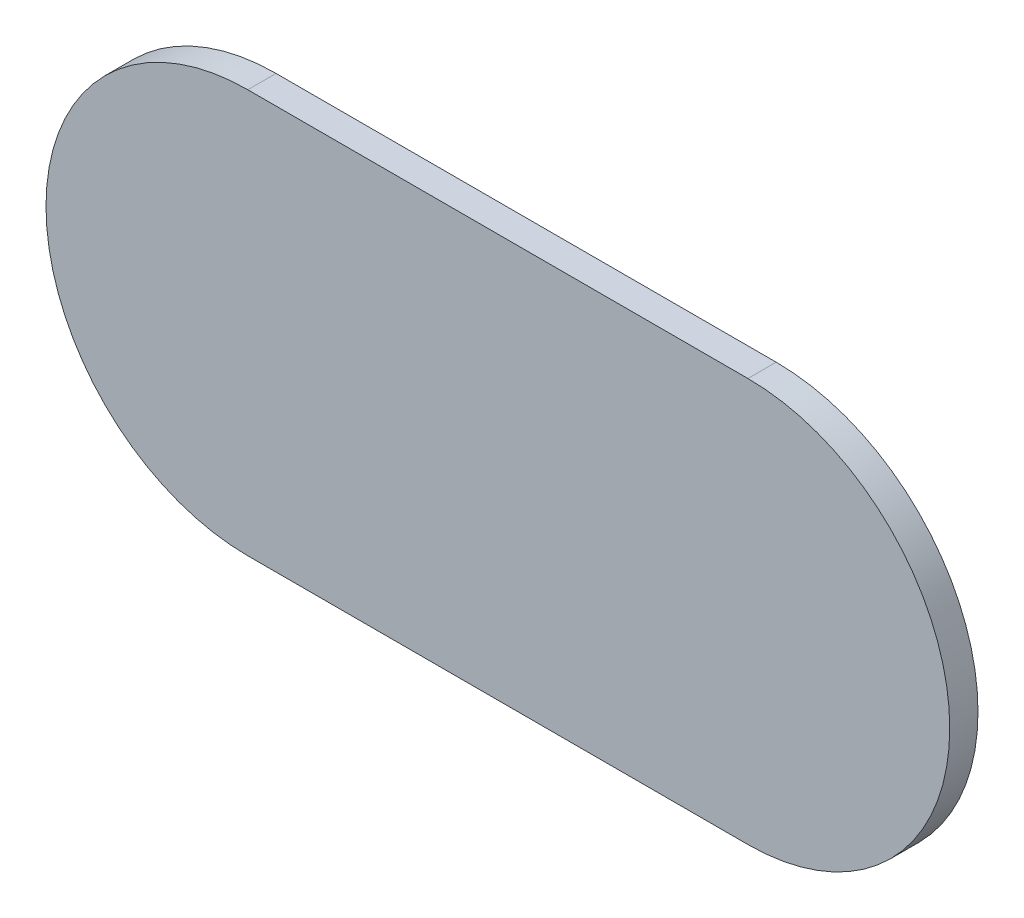
ISO-10303-21;
HEADER;
FILE_DESCRIPTION(('STEP AP214'),'2;1');
FILE_NAME('part.step','',(''),(''),'','','');
FILE_SCHEMA(('AUTOMOTIVE_DESIGN { 1 0 10303 214 1 1 1 1 }'));
ENDSEC;
DATA;
#1=APPLICATION_CONTEXT('core data for automotive mechanical design processes');
#2=APPLICATION_PROTOCOL_DEFINITION('international standard','automotive_design',2000,#1);
#3=PRODUCT_CONTEXT('',#1,'mechanical');
#4=PRODUCT('Part','Part','',(#3));
#5=PRODUCT_RELATED_PRODUCT_CATEGORY('part','',(#4));
#6=PRODUCT_DEFINITION_FORMATION('','',#4);
#7=PRODUCT_DEFINITION_CONTEXT('part definition',#1,'design');
#8=PRODUCT_DEFINITION('design','',#6,#7);
#9=PRODUCT_DEFINITION_SHAPE('','',#8);
#10=(LENGTH_UNIT() NAMED_UNIT(*) SI_UNIT(.MILLI.,.METRE.));
#11=(NAMED_UNIT(*) PLANE_ANGLE_UNIT() SI_UNIT($,.RADIAN.));
#12=(NAMED_UNIT(*) SI_UNIT($,.STERADIAN.) SOLID_ANGLE_UNIT());
#13=UNCERTAINTY_MEASURE_WITH_UNIT(LENGTH_MEASURE(1.E-05),#10,'distance_accuracy_value','');
#14=(GEOMETRIC_REPRESENTATION_CONTEXT(3) GLOBAL_UNCERTAINTY_ASSIGNED_CONTEXT((#13)) GLOBAL_UNIT_ASSIGNED_CONTEXT((#10,
#11,#12)) REPRESENTATION_CONTEXT('',''));
#15=CARTESIAN_POINT('',(0.,0.,0.));
#16=DIRECTION('',(0.,0.,1.));
#17=DIRECTION('',(1.,0.,0.));
#18=AXIS2_PLACEMENT_3D('',#15,#16,#17);
#19=CARTESIAN_POINT('',(135.99,-114.67,1.635));
#20=DIRECTION('',(0.,0.,1.));
#21=DIRECTION('',(1.,0.,0.));
#22=AXIS2_PLACEMENT_3D('',#19,#20,#21);
#23=PLANE('',#22);
#24=DIRECTION('',(1.,0.,0.));
#25=VECTOR('',#24,1.);
#26=CARTESIAN_POINT('',(135.99,-114.67,1.635));
#27=LINE('',#26,#25);
#28=CARTESIAN_POINT('',(135.99,-114.67,1.635));
#29=VERTEX_POINT('',#28);
#30=CARTESIAN_POINT('',(136.609534,-114.67,1.635));
#31=VERTEX_POINT('',#30);
#32=EDGE_CURVE('E91',#29,#31,#27,.T.);
#33=ORIENTED_EDGE('',*,*,#32,.T.);
#34=CARTESIAN_POINT('',(136.609534,-114.42,1.635));
#35=DIRECTION('',(0.,0.,1.));
#36=DIRECTION('',(0.,-1.,0.));
#37=AXIS2_PLACEMENT_3D('',#34,#35,#36);
#38=CIRCLE('',#37,0.25);
#39=CARTESIAN_POINT('',(136.609534,-114.17,1.635));
#40=VERTEX_POINT('',#39);
#41=EDGE_CURVE('E72',#31,#40,#38,.T.);
#42=ORIENTED_EDGE('',*,*,#41,.T.);
#43=DIRECTION('',(-1.,0.,0.));
#44=VECTOR('',#43,1.);
#45=CARTESIAN_POINT('',(136.609534,-114.17,1.635));
#46=LINE('',#45,#44);
#47=CARTESIAN_POINT('',(135.99,-114.17,1.635));
#48=VERTEX_POINT('',#47);
#49=EDGE_CURVE('E84',#40,#48,#46,.T.);
#50=ORIENTED_EDGE('',*,*,#49,.T.);
#51=CARTESIAN_POINT('',(135.99,-114.42,1.635));
#52=DIRECTION('',(0.,0.,1.));
#53=DIRECTION('',(0.,1.,0.));
#54=AXIS2_PLACEMENT_3D('',#51,#52,#53);
#55=CIRCLE('',#54,0.25);
#56=EDGE_CURVE('E11',#48,#29,#55,.T.);
#57=ORIENTED_EDGE('',*,*,#56,.T.);
#58=EDGE_LOOP('',(#33,#42,#50,#57));
#59=FACE_BOUND('',#58,.T.);
#60=ADVANCED_FACE('F17',(#59),#23,.T.);
#61=CARTESIAN_POINT('',(135.99,-114.67,1.6));
#62=DIRECTION('',(0.,0.,1.));
#63=DIRECTION('',(1.,0.,0.));
#64=AXIS2_PLACEMENT_3D('',#61,#62,#63);
#65=PLANE('',#64);
#66=CARTESIAN_POINT('',(135.99,-114.42,1.6));
#67=DIRECTION('',(0.,0.,1.));
#68=DIRECTION('',(0.,1.,0.));
#69=AXIS2_PLACEMENT_3D('',#66,#67,#68);
#70=CIRCLE('',#69,0.25);
#71=CARTESIAN_POINT('',(135.99,-114.17,1.6));
#72=VERTEX_POINT('',#71);
#73=CARTESIAN_POINT('',(135.99,-114.67,1.6));
#74=VERTEX_POINT('',#73);
#75=EDGE_CURVE('E27',#72,#74,#70,.T.);
#76=ORIENTED_EDGE('',*,*,#75,.F.);
#77=DIRECTION('',(-1.,0.,0.));
#78=VECTOR('',#77,1.);
#79=CARTESIAN_POINT('',(136.609534,-114.17,1.6));
#80=LINE('',#79,#78);
#81=CARTESIAN_POINT('',(136.609534,-114.17,1.6));
#82=VERTEX_POINT('',#81);
#83=EDGE_CURVE('E53',#82,#72,#80,.T.);
#84=ORIENTED_EDGE('',*,*,#83,.F.);
#85=CARTESIAN_POINT('',(136.609534,-114.42,1.6));
#86=DIRECTION('',(0.,0.,1.));
#87=DIRECTION('',(0.,-1.,0.));
#88=AXIS2_PLACEMENT_3D('',#85,#86,#87);
#89=CIRCLE('',#88,0.25);
#90=CARTESIAN_POINT('',(136.609534,-114.67,1.6));
#91=VERTEX_POINT('',#90);
#92=EDGE_CURVE('E93',#91,#82,#89,.T.);
#93=ORIENTED_EDGE('',*,*,#92,.F.);
#94=DIRECTION('',(1.,0.,0.));
#95=VECTOR('',#94,1.);
#96=CARTESIAN_POINT('',(135.99,-114.67,1.6));
#97=LINE('',#96,#95);
#98=EDGE_CURVE('E90',#74,#91,#97,.T.);
#99=ORIENTED_EDGE('',*,*,#98,.F.);
#100=EDGE_LOOP('',(#76,#84,#93,#99));
#101=FACE_BOUND('',#100,.T.);
#102=ADVANCED_FACE('F95',(#101),#65,.F.);
#103=CARTESIAN_POINT('',(135.99,-114.42,1.6));
#104=DIRECTION('',(0.,0.,-1.));
#105=DIRECTION('',(0.,1.,0.));
#106=AXIS2_PLACEMENT_3D('',#103,#104,#105);
#107=CYLINDRICAL_SURFACE('',#106,0.25);
#108=ORIENTED_EDGE('',*,*,#75,.T.);
#109=DIRECTION('',(0.,0.,1.));
#110=VECTOR('',#109,1.);
#111=CARTESIAN_POINT('',(135.99,-114.67,1.6));
#112=LINE('',#111,#110);
#113=EDGE_CURVE('E79',#74,#29,#112,.T.);
#114=ORIENTED_EDGE('',*,*,#113,.T.);
#115=ORIENTED_EDGE('',*,*,#56,.F.);
#116=DIRECTION('',(0.,0.,1.));
#117=VECTOR('',#116,1.);
#118=CARTESIAN_POINT('',(135.99,-114.17,1.6));
#119=LINE('',#118,#117);
#120=EDGE_CURVE('E20',#72,#48,#119,.T.);
#121=ORIENTED_EDGE('',*,*,#120,.F.);
#122=EDGE_LOOP('',(#108,#114,#115,#121));
#123=FACE_BOUND('',#122,.T.);
#124=ADVANCED_FACE('F78',(#123),#107,.T.);
#125=CARTESIAN_POINT('',(136.609534,-114.17,1.6));
#126=DIRECTION('',(0.,-1.,0.));
#127=DIRECTION('',(0.,0.,-1.));
#128=AXIS2_PLACEMENT_3D('',#125,#126,#127);
#129=PLANE('',#128);
#130=ORIENTED_EDGE('',*,*,#83,.T.);
#131=ORIENTED_EDGE('',*,*,#120,.T.);
#132=ORIENTED_EDGE('',*,*,#49,.F.);
#133=DIRECTION('',(0.,0.,1.));
#134=VECTOR('',#133,1.);
#135=CARTESIAN_POINT('',(136.609534,-114.17,1.6));
#136=LINE('',#135,#134);
#137=EDGE_CURVE('E112',#82,#40,#136,.T.);
#138=ORIENTED_EDGE('',*,*,#137,.F.);
#139=EDGE_LOOP('',(#130,#131,#132,#138));
#140=FACE_BOUND('',#139,.T.);
#141=ADVANCED_FACE('F124',(#140),#129,.F.);
#142=CARTESIAN_POINT('',(136.609534,-114.42,1.6));
#143=DIRECTION('',(0.,0.,-1.));
#144=DIRECTION('',(0.,-1.,0.));
#145=AXIS2_PLACEMENT_3D('',#142,#143,#144);
#146=CYLINDRICAL_SURFACE('',#145,0.25);
#147=ORIENTED_EDGE('',*,*,#92,.T.);
#148=ORIENTED_EDGE('',*,*,#137,.T.);
#149=ORIENTED_EDGE('',*,*,#41,.F.);
#150=DIRECTION('',(0.,0.,1.));
#151=VECTOR('',#150,1.);
#152=CARTESIAN_POINT('',(136.609534,-114.67,1.6));
#153=LINE('',#152,#151);
#154=EDGE_CURVE('E98',#91,#31,#153,.T.);
#155=ORIENTED_EDGE('',*,*,#154,.F.);
#156=EDGE_LOOP('',(#147,#148,#149,#155));
#157=FACE_BOUND('',#156,.T.);
#158=ADVANCED_FACE('F125',(#157),#146,.T.);
#159=CARTESIAN_POINT('',(135.99,-114.67,1.6));
#160=DIRECTION('',(0.,1.,0.));
#161=DIRECTION('',(1.,0.,0.));
#162=AXIS2_PLACEMENT_3D('',#159,#160,#161);
#163=PLANE('',#162);
#164=ORIENTED_EDGE('',*,*,#98,.T.);
#165=ORIENTED_EDGE('',*,*,#154,.T.);
#166=ORIENTED_EDGE('',*,*,#32,.F.);
#167=ORIENTED_EDGE('',*,*,#113,.F.);
#168=EDGE_LOOP('',(#164,#165,#166,#167));
#169=FACE_BOUND('',#168,.T.);
#170=ADVANCED_FACE('F88',(#169),#163,.F.);
#171=CLOSED_SHELL('',(#60,#102,#124,#141,#158,#170));
#172=MANIFOLD_SOLID_BREP('B1',#171);
#173=ADVANCED_BREP_SHAPE_REPRESENTATION('',(#18,#172),#14);
#174=SHAPE_DEFINITION_REPRESENTATION(#9,#173);
ENDSEC;
END-ISO-10303-21;
